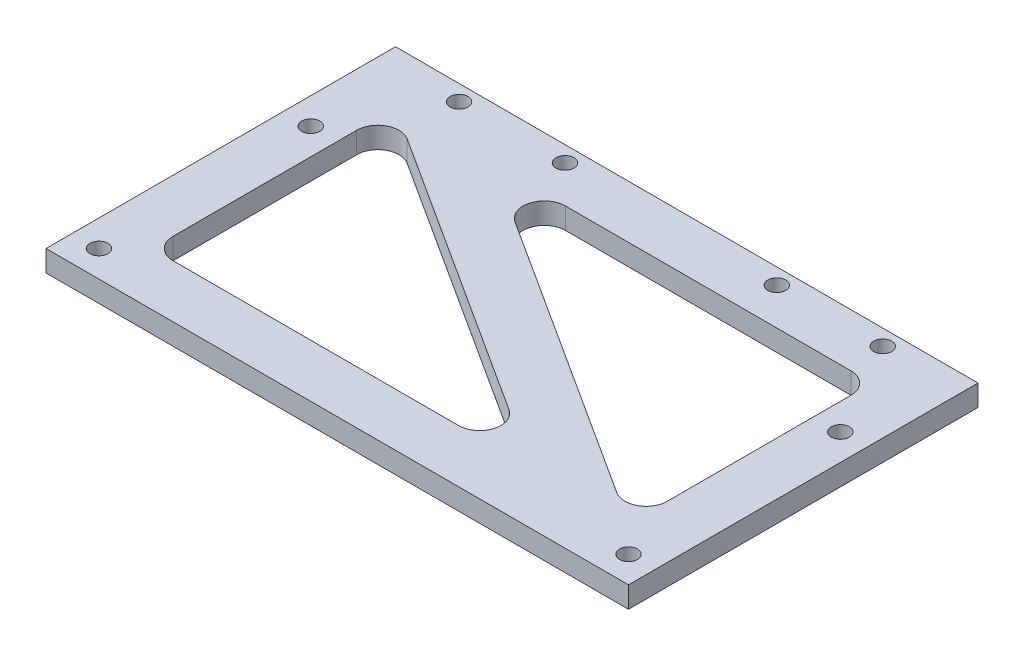
ISO-10303-21;
HEADER;
FILE_DESCRIPTION(('STEP AP214'),'2;1');
FILE_NAME('part.step','',(''),(''),'','','');
FILE_SCHEMA(('AUTOMOTIVE_DESIGN { 1 0 10303 214 1 1 1 1 }'));
ENDSEC;
DATA;
#1=APPLICATION_CONTEXT('core data for automotive mechanical design processes');
#2=APPLICATION_PROTOCOL_DEFINITION('international standard','automotive_design',2000,#1);
#3=PRODUCT_CONTEXT('',#1,'mechanical');
#4=PRODUCT('Part','Part','',(#3));
#5=PRODUCT_RELATED_PRODUCT_CATEGORY('part','',(#4));
#6=PRODUCT_DEFINITION_FORMATION('','',#4);
#7=PRODUCT_DEFINITION_CONTEXT('part definition',#1,'design');
#8=PRODUCT_DEFINITION('design','',#6,#7);
#9=PRODUCT_DEFINITION_SHAPE('','',#8);
#10=(LENGTH_UNIT() NAMED_UNIT(*) SI_UNIT(.MILLI.,.METRE.));
#11=(NAMED_UNIT(*) PLANE_ANGLE_UNIT() SI_UNIT($,.RADIAN.));
#12=(NAMED_UNIT(*) SI_UNIT($,.STERADIAN.) SOLID_ANGLE_UNIT());
#13=UNCERTAINTY_MEASURE_WITH_UNIT(LENGTH_MEASURE(1.E-05),#10,'distance_accuracy_value','');
#14=(GEOMETRIC_REPRESENTATION_CONTEXT(3) GLOBAL_UNCERTAINTY_ASSIGNED_CONTEXT((#13)) GLOBAL_UNIT_ASSIGNED_CONTEXT((#10,
#11,#12)) REPRESENTATION_CONTEXT('',''));
#15=CARTESIAN_POINT('',(0.,0.,0.));
#16=DIRECTION('',(0.,0.,1.));
#17=DIRECTION('',(1.,0.,0.));
#18=AXIS2_PLACEMENT_3D('',#15,#16,#17);
#19=CARTESIAN_POINT('',(0.,4.,0.));
#20=DIRECTION('',(0.,-1.,0.));
#21=DIRECTION('',(0.,0.,-1.));
#22=AXIS2_PLACEMENT_3D('',#19,#20,#21);
#23=PLANE('',#22);
#24=DIRECTION('',(0.841038517197505,0.,0.54097524212317));
#25=VECTOR('',#24,1.);
#26=CARTESIAN_POINT('',(28.4054789925488,4.,-44.1611742497059));
#27=LINE('',#26,#25);
#28=CARTESIAN_POINT('',(16.1639009684927,4.,-52.035237684518));
#29=VERTEX_POINT('',#28);
#30=CARTESIAN_POINT('',(70.0660289833704,4.,-17.36415406879));
#31=VERTEX_POINT('',#30);
#32=EDGE_CURVE('E310',#29,#31,#27,.T.);
#33=ORIENTED_EDGE('',*,*,#32,.T.);
#34=CARTESIAN_POINT('',(67.9021280148777,4.,-14.));
#35=DIRECTION('',(0.,-1.,0.));
#36=DIRECTION('',(0.,0.,-1.));
#37=AXIS2_PLACEMENT_3D('',#34,#35,#36);
#38=CIRCLE('',#37,4.);
#39=CARTESIAN_POINT('',(67.9021280148777,4.,-10.));
#40=VERTEX_POINT('',#39);
#41=EDGE_CURVE('E244',#31,#40,#38,.T.);
#42=ORIENTED_EDGE('',*,*,#41,.T.);
#43=DIRECTION('',(-1.,0.,0.));
#44=VECTOR('',#43,1.);
#45=CARTESIAN_POINT('',(0.,4.,-10.));
#46=LINE('',#45,#44);
#47=CARTESIAN_POINT('',(14.,4.,-10.));
#48=VERTEX_POINT('',#47);
#49=EDGE_CURVE('E311',#40,#48,#46,.T.);
#50=ORIENTED_EDGE('',*,*,#49,.T.);
#51=CARTESIAN_POINT('',(14.,4.,-14.));
#52=DIRECTION('',(0.,-1.,0.));
#53=DIRECTION('',(0.,0.,-1.));
#54=AXIS2_PLACEMENT_3D('',#51,#52,#53);
#55=CIRCLE('',#54,4.);
#56=CARTESIAN_POINT('',(10.,4.,-14.));
#57=VERTEX_POINT('',#56);
#58=EDGE_CURVE('E248',#48,#57,#55,.T.);
#59=ORIENTED_EDGE('',*,*,#58,.T.);
#60=DIRECTION('',(0.,0.,-1.));
#61=VECTOR('',#60,1.);
#62=CARTESIAN_POINT('',(10.,4.,0.));
#63=LINE('',#62,#61);
#64=CARTESIAN_POINT('',(10.,4.,-48.671083615728));
#65=VERTEX_POINT('',#64);
#66=EDGE_CURVE('E320',#57,#65,#63,.T.);
#67=ORIENTED_EDGE('',*,*,#66,.T.);
#68=CARTESIAN_POINT('',(14.,4.,-48.671083615728));
#69=DIRECTION('',(0.,-1.,0.));
#70=DIRECTION('',(0.,0.,-1.));
#71=AXIS2_PLACEMENT_3D('',#68,#69,#70);
#72=CIRCLE('',#71,4.);
#73=EDGE_CURVE('E254',#65,#29,#72,.T.);
#74=ORIENTED_EDGE('',*,*,#73,.T.);
#75=EDGE_LOOP('',(#33,#42,#50,#59,#67,#74));
#76=FACE_BOUND('',#75,.T.);
#77=DIRECTION('',(0.,0.,1.));
#78=VECTOR('',#77,1.);
#79=CARTESIAN_POINT('',(100.,4.,0.));
#80=LINE('',#79,#78);
#81=CARTESIAN_POINT('',(100.,4.,-52.));
#82=VERTEX_POINT('',#81);
#83=CARTESIAN_POINT('',(100.,4.,-17.3289163842721));
#84=VERTEX_POINT('',#83);
#85=EDGE_CURVE('E288',#82,#84,#80,.T.);
#86=ORIENTED_EDGE('',*,*,#85,.T.);
#87=CARTESIAN_POINT('',(96.,4.,-17.3289163842721));
#88=DIRECTION('',(0.,-1.,0.));
#89=DIRECTION('',(0.,0.,-1.));
#90=AXIS2_PLACEMENT_3D('',#87,#88,#89);
#91=CIRCLE('',#90,4.);
#92=CARTESIAN_POINT('',(93.8360990315073,4.,-13.964762315482));
#93=VERTEX_POINT('',#92);
#94=EDGE_CURVE('E261',#84,#93,#91,.T.);
#95=ORIENTED_EDGE('',*,*,#94,.T.);
#96=DIRECTION('',(-0.841038517197505,0.,-0.54097524212317));
#97=VECTOR('',#96,1.);
#98=CARTESIAN_POINT('',(33.8152314137805,4.,-52.571559421681));
#99=LINE('',#98,#97);
#100=CARTESIAN_POINT('',(39.9339710166296,4.,-48.63584593121));
#101=VERTEX_POINT('',#100);
#102=EDGE_CURVE('E296',#93,#101,#99,.T.);
#103=ORIENTED_EDGE('',*,*,#102,.T.);
#104=CARTESIAN_POINT('',(42.0978719851223,4.,-52.));
#105=DIRECTION('',(0.,-1.,0.));
#106=DIRECTION('',(0.,0.,-1.));
#107=AXIS2_PLACEMENT_3D('',#104,#105,#106);
#108=CIRCLE('',#107,4.);
#109=CARTESIAN_POINT('',(42.0978719851223,4.,-56.));
#110=VERTEX_POINT('',#109);
#111=EDGE_CURVE('E75',#101,#110,#108,.T.);
#112=ORIENTED_EDGE('',*,*,#111,.T.);
#113=DIRECTION('',(1.,0.,0.));
#114=VECTOR('',#113,1.);
#115=CARTESIAN_POINT('',(0.,4.,-56.));
#116=LINE('',#115,#114);
#117=CARTESIAN_POINT('',(96.,4.,-56.));
#118=VERTEX_POINT('',#117);
#119=EDGE_CURVE('E292',#110,#118,#116,.T.);
#120=ORIENTED_EDGE('',*,*,#119,.T.);
#121=CARTESIAN_POINT('',(96.,4.,-52.));
#122=DIRECTION('',(0.,-1.,0.));
#123=DIRECTION('',(0.,0.,-1.));
#124=AXIS2_PLACEMENT_3D('',#121,#122,#123);
#125=CIRCLE('',#124,4.);
#126=EDGE_CURVE('E11',#118,#82,#125,.T.);
#127=ORIENTED_EDGE('',*,*,#126,.T.);
#128=EDGE_LOOP('',(#86,#95,#103,#112,#120,#127));
#129=FACE_BOUND('',#128,.T.);
#130=DIRECTION('',(0.,0.,1.));
#131=VECTOR('',#130,1.);
#132=CARTESIAN_POINT('',(0.,4.,0.));
#133=LINE('',#132,#131);
#134=CARTESIAN_POINT('',(0.,4.,-66.));
#135=VERTEX_POINT('',#134);
#136=CARTESIAN_POINT('',(0.,4.,0.));
#137=VERTEX_POINT('',#136);
#138=EDGE_CURVE('E176',#135,#137,#133,.T.);
#139=ORIENTED_EDGE('',*,*,#138,.T.);
#140=DIRECTION('',(1.,0.,0.));
#141=VECTOR('',#140,1.);
#142=CARTESIAN_POINT('',(0.,4.,0.));
#143=LINE('',#142,#141);
#144=CARTESIAN_POINT('',(110.,4.,0.));
#145=VERTEX_POINT('',#144);
#146=EDGE_CURVE('E163',#137,#145,#143,.T.);
#147=ORIENTED_EDGE('',*,*,#146,.T.);
#148=DIRECTION('',(0.,0.,-1.));
#149=VECTOR('',#148,1.);
#150=CARTESIAN_POINT('',(110.,4.,0.));
#151=LINE('',#150,#149);
#152=CARTESIAN_POINT('',(110.,4.,-66.));
#153=VERTEX_POINT('',#152);
#154=EDGE_CURVE('E175',#145,#153,#151,.T.);
#155=ORIENTED_EDGE('',*,*,#154,.T.);
#156=DIRECTION('',(-1.,0.,0.));
#157=VECTOR('',#156,1.);
#158=CARTESIAN_POINT('',(0.,4.,-66.));
#159=LINE('',#158,#157);
#160=EDGE_CURVE('E182',#153,#135,#159,.T.);
#161=ORIENTED_EDGE('',*,*,#160,.T.);
#162=EDGE_LOOP('',(#139,#147,#155,#161));
#163=FACE_BOUND('',#162,.T.);
#164=CARTESIAN_POINT('',(4.99999999999999,4.,-45.));
#165=DIRECTION('',(0.,1.,0.));
#166=DIRECTION('',(0.,0.,1.));
#167=AXIS2_PLACEMENT_3D('',#164,#165,#166);
#168=CIRCLE('',#167,1.7);
#169=CARTESIAN_POINT('',(4.99999999999999,4.,-43.3));
#170=VERTEX_POINT('',#169);
#171=EDGE_CURVE('E380',#170,#170,#168,.T.);
#172=ORIENTED_EDGE('',*,*,#171,.F.);
#173=EDGE_LOOP('',(#172));
#174=FACE_BOUND('',#173,.T.);
#175=CARTESIAN_POINT('',(4.99999999999999,4.,-5.));
#176=DIRECTION('',(0.,1.,0.));
#177=DIRECTION('',(0.,0.,1.));
#178=AXIS2_PLACEMENT_3D('',#175,#176,#177);
#179=CIRCLE('',#178,1.7);
#180=CARTESIAN_POINT('',(4.99999999999999,4.,-3.3));
#181=VERTEX_POINT('',#180);
#182=EDGE_CURVE('E369',#181,#181,#179,.T.);
#183=ORIENTED_EDGE('',*,*,#182,.F.);
#184=EDGE_LOOP('',(#183));
#185=FACE_BOUND('',#184,.T.);
#186=CARTESIAN_POINT('',(105.,4.,-5.00000000000001));
#187=DIRECTION('',(0.,1.,0.));
#188=DIRECTION('',(0.,0.,-1.));
#189=AXIS2_PLACEMENT_3D('',#186,#187,#188);
#190=CIRCLE('',#189,1.7);
#191=CARTESIAN_POINT('',(105.,4.,-6.70000000000001));
#192=VERTEX_POINT('',#191);
#193=EDGE_CURVE('E363',#192,#192,#190,.T.);
#194=ORIENTED_EDGE('',*,*,#193,.F.);
#195=EDGE_LOOP('',(#194));
#196=FACE_BOUND('',#195,.T.);
#197=CARTESIAN_POINT('',(105.,4.,-45.));
#198=DIRECTION('',(0.,1.,0.));
#199=DIRECTION('',(0.,0.,-1.));
#200=AXIS2_PLACEMENT_3D('',#197,#198,#199);
#201=CIRCLE('',#200,1.7);
#202=CARTESIAN_POINT('',(105.,4.,-46.7));
#203=VERTEX_POINT('',#202);
#204=EDGE_CURVE('E354',#203,#203,#201,.T.);
#205=ORIENTED_EDGE('',*,*,#204,.F.);
#206=EDGE_LOOP('',(#205));
#207=FACE_BOUND('',#206,.T.);
#208=CARTESIAN_POINT('',(15.,4.,-63.));
#209=DIRECTION('',(0.,1.,0.));
#210=DIRECTION('',(0.,0.,1.));
#211=AXIS2_PLACEMENT_3D('',#208,#209,#210);
#212=CIRCLE('',#211,1.7);
#213=CARTESIAN_POINT('',(15.,4.,-61.3));
#214=VERTEX_POINT('',#213);
#215=EDGE_CURVE('E345',#214,#214,#212,.T.);
#216=ORIENTED_EDGE('',*,*,#215,.F.);
#217=EDGE_LOOP('',(#216));
#218=FACE_BOUND('',#217,.T.);
#219=CARTESIAN_POINT('',(35.,4.,-63.));
#220=DIRECTION('',(0.,1.,0.));
#221=DIRECTION('',(0.,0.,1.));
#222=AXIS2_PLACEMENT_3D('',#219,#220,#221);
#223=CIRCLE('',#222,1.7);
#224=CARTESIAN_POINT('',(35.,4.,-61.3));
#225=VERTEX_POINT('',#224);
#226=EDGE_CURVE('E339',#225,#225,#223,.T.);
#227=ORIENTED_EDGE('',*,*,#226,.F.);
#228=EDGE_LOOP('',(#227));
#229=FACE_BOUND('',#228,.T.);
#230=CARTESIAN_POINT('',(75.,4.,-63.));
#231=DIRECTION('',(0.,1.,0.));
#232=DIRECTION('',(0.,0.,-1.));
#233=AXIS2_PLACEMENT_3D('',#230,#231,#232);
#234=CIRCLE('',#233,1.7);
#235=CARTESIAN_POINT('',(75.,4.,-64.7));
#236=VERTEX_POINT('',#235);
#237=EDGE_CURVE('E329',#236,#236,#234,.T.);
#238=ORIENTED_EDGE('',*,*,#237,.F.);
#239=EDGE_LOOP('',(#238));
#240=FACE_BOUND('',#239,.T.);
#241=CARTESIAN_POINT('',(95.,4.,-63.));
#242=DIRECTION('',(0.,1.,0.));
#243=DIRECTION('',(0.,0.,-1.));
#244=AXIS2_PLACEMENT_3D('',#241,#242,#243);
#245=CIRCLE('',#244,1.7);
#246=CARTESIAN_POINT('',(95.,4.,-64.7));
#247=VERTEX_POINT('',#246);
#248=EDGE_CURVE('E325',#247,#247,#245,.T.);
#249=ORIENTED_EDGE('',*,*,#248,.F.);
#250=EDGE_LOOP('',(#249));
#251=FACE_BOUND('',#250,.T.);
#252=ADVANCED_FACE('F47',(#76,#129,#163,#174,#185,#196,#207,#218,#229,#240,#251),#23,.F.);
#253=CARTESIAN_POINT('',(0.,0.,0.));
#254=DIRECTION('',(0.,-1.,0.));
#255=DIRECTION('',(0.,0.,-1.));
#256=AXIS2_PLACEMENT_3D('',#253,#254,#255);
#257=PLANE('',#256);
#258=DIRECTION('',(0.,0.,-1.));
#259=VECTOR('',#258,1.);
#260=CARTESIAN_POINT('',(10.,0.,-10.));
#261=LINE('',#260,#259);
#262=CARTESIAN_POINT('',(10.,0.,-14.));
#263=VERTEX_POINT('',#262);
#264=CARTESIAN_POINT('',(10.,0.,-48.671083615728));
#265=VERTEX_POINT('',#264);
#266=EDGE_CURVE('E283',#263,#265,#261,.T.);
#267=ORIENTED_EDGE('',*,*,#266,.F.);
#268=CARTESIAN_POINT('',(14.,0.,-14.));
#269=DIRECTION('',(0.,-1.,0.));
#270=DIRECTION('',(0.,0.,-1.));
#271=AXIS2_PLACEMENT_3D('',#268,#269,#270);
#272=CIRCLE('',#271,4.);
#273=CARTESIAN_POINT('',(14.,0.,-10.));
#274=VERTEX_POINT('',#273);
#275=EDGE_CURVE('E246',#263,#274,#272,.F.);
#276=ORIENTED_EDGE('',*,*,#275,.T.);
#277=DIRECTION('',(-1.,0.,0.));
#278=VECTOR('',#277,1.);
#279=CARTESIAN_POINT('',(81.5148657066949,0.,-9.99999999999999));
#280=LINE('',#279,#278);
#281=CARTESIAN_POINT('',(67.9021280148777,0.,-10.));
#282=VERTEX_POINT('',#281);
#283=EDGE_CURVE('E495',#282,#274,#280,.T.);
#284=ORIENTED_EDGE('',*,*,#283,.F.);
#285=CARTESIAN_POINT('',(67.9021280148777,0.,-14.));
#286=DIRECTION('',(0.,-1.,0.));
#287=DIRECTION('',(0.,0.,-1.));
#288=AXIS2_PLACEMENT_3D('',#285,#286,#287);
#289=CIRCLE('',#288,4.);
#290=CARTESIAN_POINT('',(70.0660289833704,0.,-17.36415406879));
#291=VERTEX_POINT('',#290);
#292=EDGE_CURVE('E241',#282,#291,#289,.F.);
#293=ORIENTED_EDGE('',*,*,#292,.T.);
#294=DIRECTION('',(0.841038517197505,0.,0.54097524212317));
#295=VECTOR('',#294,1.);
#296=CARTESIAN_POINT('',(10.,0.,-56.));
#297=LINE('',#296,#295);
#298=CARTESIAN_POINT('',(16.1639009684927,0.,-52.035237684518));
#299=VERTEX_POINT('',#298);
#300=EDGE_CURVE('E497',#299,#291,#297,.T.);
#301=ORIENTED_EDGE('',*,*,#300,.F.);
#302=CARTESIAN_POINT('',(14.,0.,-48.671083615728));
#303=DIRECTION('',(0.,-1.,0.));
#304=DIRECTION('',(0.,0.,-1.));
#305=AXIS2_PLACEMENT_3D('',#302,#303,#304);
#306=CIRCLE('',#305,4.);
#307=EDGE_CURVE('E252',#299,#265,#306,.F.);
#308=ORIENTED_EDGE('',*,*,#307,.T.);
#309=EDGE_LOOP('',(#267,#276,#284,#293,#301,#308));
#310=FACE_BOUND('',#309,.T.);
#311=DIRECTION('',(1.,0.,0.));
#312=VECTOR('',#311,1.);
#313=CARTESIAN_POINT('',(28.4851342933051,0.,-56.));
#314=LINE('',#313,#312);
#315=CARTESIAN_POINT('',(42.0978719851223,0.,-56.));
#316=VERTEX_POINT('',#315);
#317=CARTESIAN_POINT('',(96.,0.,-56.));
#318=VERTEX_POINT('',#317);
#319=EDGE_CURVE('E277',#316,#318,#314,.T.);
#320=ORIENTED_EDGE('',*,*,#319,.F.);
#321=CARTESIAN_POINT('',(42.0978719851223,0.,-52.));
#322=DIRECTION('',(0.,-1.,0.));
#323=DIRECTION('',(0.,0.,-1.));
#324=AXIS2_PLACEMENT_3D('',#321,#322,#323);
#325=CIRCLE('',#324,4.);
#326=CARTESIAN_POINT('',(39.9339710166296,0.,-48.63584593121));
#327=VERTEX_POINT('',#326);
#328=EDGE_CURVE('E262',#316,#327,#325,.F.);
#329=ORIENTED_EDGE('',*,*,#328,.T.);
#330=DIRECTION('',(-0.841038517197505,0.,-0.54097524212317));
#331=VECTOR('',#330,1.);
#332=CARTESIAN_POINT('',(100.,0.,-10.));
#333=LINE('',#332,#331);
#334=CARTESIAN_POINT('',(93.8360990315073,0.,-13.964762315482));
#335=VERTEX_POINT('',#334);
#336=EDGE_CURVE('E297',#335,#327,#333,.T.);
#337=ORIENTED_EDGE('',*,*,#336,.F.);
#338=CARTESIAN_POINT('',(96.,0.,-17.3289163842721));
#339=DIRECTION('',(0.,-1.,0.));
#340=DIRECTION('',(0.,0.,-1.));
#341=AXIS2_PLACEMENT_3D('',#338,#339,#340);
#342=CIRCLE('',#341,4.);
#343=CARTESIAN_POINT('',(100.,0.,-17.3289163842721));
#344=VERTEX_POINT('',#343);
#345=EDGE_CURVE('E256',#335,#344,#342,.F.);
#346=ORIENTED_EDGE('',*,*,#345,.T.);
#347=DIRECTION('',(0.,0.,1.));
#348=VECTOR('',#347,1.);
#349=CARTESIAN_POINT('',(100.,0.,-56.));
#350=LINE('',#349,#348);
#351=CARTESIAN_POINT('',(100.,0.,-52.));
#352=VERTEX_POINT('',#351);
#353=EDGE_CURVE('E279',#352,#344,#350,.T.);
#354=ORIENTED_EDGE('',*,*,#353,.F.);
#355=CARTESIAN_POINT('',(96.,0.,-52.));
#356=DIRECTION('',(0.,-1.,0.));
#357=DIRECTION('',(0.,0.,-1.));
#358=AXIS2_PLACEMENT_3D('',#355,#356,#357);
#359=CIRCLE('',#358,4.);
#360=EDGE_CURVE('E59',#352,#318,#359,.F.);
#361=ORIENTED_EDGE('',*,*,#360,.T.);
#362=EDGE_LOOP('',(#320,#329,#337,#346,#354,#361));
#363=FACE_BOUND('',#362,.T.);
#364=CARTESIAN_POINT('',(75.,0.,-63.));
#365=DIRECTION('',(0.,1.,0.));
#366=DIRECTION('',(0.,0.,-1.));
#367=AXIS2_PLACEMENT_3D('',#364,#365,#366);
#368=CIRCLE('',#367,1.7);
#369=CARTESIAN_POINT('',(75.,0.,-64.7));
#370=VERTEX_POINT('',#369);
#371=EDGE_CURVE('E326',#370,#370,#368,.T.);
#372=ORIENTED_EDGE('',*,*,#371,.T.);
#373=EDGE_LOOP('',(#372));
#374=FACE_BOUND('',#373,.T.);
#375=CARTESIAN_POINT('',(15.,0.,-63.));
#376=DIRECTION('',(0.,1.,0.));
#377=DIRECTION('',(0.,0.,1.));
#378=AXIS2_PLACEMENT_3D('',#375,#376,#377);
#379=CIRCLE('',#378,1.7);
#380=CARTESIAN_POINT('',(15.,0.,-61.3));
#381=VERTEX_POINT('',#380);
#382=EDGE_CURVE('E341',#381,#381,#379,.T.);
#383=ORIENTED_EDGE('',*,*,#382,.T.);
#384=EDGE_LOOP('',(#383));
#385=FACE_BOUND('',#384,.T.);
#386=CARTESIAN_POINT('',(105.,0.,-5.00000000000001));
#387=DIRECTION('',(0.,1.,0.));
#388=DIRECTION('',(0.,0.,-1.));
#389=AXIS2_PLACEMENT_3D('',#386,#387,#388);
#390=CIRCLE('',#389,1.7);
#391=CARTESIAN_POINT('',(105.,0.,-6.70000000000001));
#392=VERTEX_POINT('',#391);
#393=EDGE_CURVE('E357',#392,#392,#390,.T.);
#394=ORIENTED_EDGE('',*,*,#393,.T.);
#395=EDGE_LOOP('',(#394));
#396=FACE_BOUND('',#395,.T.);
#397=CARTESIAN_POINT('',(4.99999999999999,0.,-45.));
#398=DIRECTION('',(0.,1.,0.));
#399=DIRECTION('',(0.,0.,1.));
#400=AXIS2_PLACEMENT_3D('',#397,#398,#399);
#401=CIRCLE('',#400,1.7);
#402=CARTESIAN_POINT('',(4.99999999999999,0.,-43.3));
#403=VERTEX_POINT('',#402);
#404=EDGE_CURVE('E373',#403,#403,#401,.T.);
#405=ORIENTED_EDGE('',*,*,#404,.T.);
#406=EDGE_LOOP('',(#405));
#407=FACE_BOUND('',#406,.T.);
#408=DIRECTION('',(0.,0.,1.));
#409=VECTOR('',#408,1.);
#410=CARTESIAN_POINT('',(0.,0.,0.));
#411=LINE('',#410,#409);
#412=CARTESIAN_POINT('',(0.,0.,-66.));
#413=VERTEX_POINT('',#412);
#414=CARTESIAN_POINT('',(0.,0.,0.));
#415=VERTEX_POINT('',#414);
#416=EDGE_CURVE('E190',#413,#415,#411,.T.);
#417=ORIENTED_EDGE('',*,*,#416,.F.);
#418=DIRECTION('',(-1.,0.,0.));
#419=VECTOR('',#418,1.);
#420=CARTESIAN_POINT('',(0.,0.,-66.));
#421=LINE('',#420,#419);
#422=CARTESIAN_POINT('',(110.,0.,-66.));
#423=VERTEX_POINT('',#422);
#424=EDGE_CURVE('E186',#423,#413,#421,.T.);
#425=ORIENTED_EDGE('',*,*,#424,.F.);
#426=DIRECTION('',(0.,0.,-1.));
#427=VECTOR('',#426,1.);
#428=CARTESIAN_POINT('',(110.,0.,0.));
#429=LINE('',#428,#427);
#430=CARTESIAN_POINT('',(110.,0.,0.));
#431=VERTEX_POINT('',#430);
#432=EDGE_CURVE('E393',#431,#423,#429,.T.);
#433=ORIENTED_EDGE('',*,*,#432,.F.);
#434=DIRECTION('',(1.,0.,0.));
#435=VECTOR('',#434,1.);
#436=CARTESIAN_POINT('',(0.,0.,0.));
#437=LINE('',#436,#435);
#438=EDGE_CURVE('E391',#415,#431,#437,.T.);
#439=ORIENTED_EDGE('',*,*,#438,.F.);
#440=EDGE_LOOP('',(#417,#425,#433,#439));
#441=FACE_BOUND('',#440,.T.);
#442=CARTESIAN_POINT('',(4.99999999999999,0.,-5.));
#443=DIRECTION('',(0.,1.,0.));
#444=DIRECTION('',(0.,0.,1.));
#445=AXIS2_PLACEMENT_3D('',#442,#443,#444);
#446=CIRCLE('',#445,1.7);
#447=CARTESIAN_POINT('',(4.99999999999999,0.,-3.3));
#448=VERTEX_POINT('',#447);
#449=EDGE_CURVE('E364',#448,#448,#446,.T.);
#450=ORIENTED_EDGE('',*,*,#449,.T.);
#451=EDGE_LOOP('',(#450));
#452=FACE_BOUND('',#451,.T.);
#453=CARTESIAN_POINT('',(105.,0.,-45.));
#454=DIRECTION('',(0.,1.,0.));
#455=DIRECTION('',(0.,0.,-1.));
#456=AXIS2_PLACEMENT_3D('',#453,#454,#455);
#457=CIRCLE('',#456,1.7);
#458=CARTESIAN_POINT('',(105.,0.,-46.7));
#459=VERTEX_POINT('',#458);
#460=EDGE_CURVE('E349',#459,#459,#457,.T.);
#461=ORIENTED_EDGE('',*,*,#460,.T.);
#462=EDGE_LOOP('',(#461));
#463=FACE_BOUND('',#462,.T.);
#464=CARTESIAN_POINT('',(35.,0.,-63.));
#465=DIRECTION('',(0.,1.,0.));
#466=DIRECTION('',(0.,0.,1.));
#467=AXIS2_PLACEMENT_3D('',#464,#465,#466);
#468=CIRCLE('',#467,1.7);
#469=CARTESIAN_POINT('',(35.,0.,-61.3));
#470=VERTEX_POINT('',#469);
#471=EDGE_CURVE('E331',#470,#470,#468,.T.);
#472=ORIENTED_EDGE('',*,*,#471,.T.);
#473=EDGE_LOOP('',(#472));
#474=FACE_BOUND('',#473,.T.);
#475=CARTESIAN_POINT('',(95.,0.,-63.));
#476=DIRECTION('',(0.,1.,0.));
#477=DIRECTION('',(0.,0.,-1.));
#478=AXIS2_PLACEMENT_3D('',#475,#476,#477);
#479=CIRCLE('',#478,1.7);
#480=CARTESIAN_POINT('',(95.,0.,-64.7));
#481=VERTEX_POINT('',#480);
#482=EDGE_CURVE('E321',#481,#481,#479,.T.);
#483=ORIENTED_EDGE('',*,*,#482,.T.);
#484=EDGE_LOOP('',(#483));
#485=FACE_BOUND('',#484,.T.);
#486=ADVANCED_FACE('F273',(#310,#363,#374,#385,#396,#407,#441,#452,#463,#474,#485),#257,.T.);
#487=CARTESIAN_POINT('',(0.,4.,0.));
#488=DIRECTION('',(1.,0.,0.));
#489=DIRECTION('',(0.,0.,-1.));
#490=AXIS2_PLACEMENT_3D('',#487,#488,#489);
#491=PLANE('',#490);
#492=ORIENTED_EDGE('',*,*,#416,.T.);
#493=DIRECTION('',(0.,-1.,0.));
#494=VECTOR('',#493,1.);
#495=CARTESIAN_POINT('',(0.,4.,0.));
#496=LINE('',#495,#494);
#497=EDGE_CURVE('E169',#137,#415,#496,.T.);
#498=ORIENTED_EDGE('',*,*,#497,.F.);
#499=ORIENTED_EDGE('',*,*,#138,.F.);
#500=DIRECTION('',(0.,-1.,0.));
#501=VECTOR('',#500,1.);
#502=CARTESIAN_POINT('',(0.,4.,-66.));
#503=LINE('',#502,#501);
#504=EDGE_CURVE('E389',#135,#413,#503,.T.);
#505=ORIENTED_EDGE('',*,*,#504,.T.);
#506=EDGE_LOOP('',(#492,#498,#499,#505));
#507=FACE_BOUND('',#506,.T.);
#508=ADVANCED_FACE('F189',(#507),#491,.F.);
#509=CARTESIAN_POINT('',(0.,4.,0.));
#510=DIRECTION('',(0.,0.,-1.));
#511=DIRECTION('',(-1.,0.,0.));
#512=AXIS2_PLACEMENT_3D('',#509,#510,#511);
#513=PLANE('',#512);
#514=ORIENTED_EDGE('',*,*,#438,.T.);
#515=DIRECTION('',(0.,-1.,0.));
#516=VECTOR('',#515,1.);
#517=CARTESIAN_POINT('',(110.,4.,0.));
#518=LINE('',#517,#516);
#519=EDGE_CURVE('E171',#145,#431,#518,.T.);
#520=ORIENTED_EDGE('',*,*,#519,.F.);
#521=ORIENTED_EDGE('',*,*,#146,.F.);
#522=ORIENTED_EDGE('',*,*,#497,.T.);
#523=EDGE_LOOP('',(#514,#520,#521,#522));
#524=FACE_BOUND('',#523,.T.);
#525=ADVANCED_FACE('F167',(#524),#513,.F.);
#526=CARTESIAN_POINT('',(110.,4.,0.));
#527=DIRECTION('',(-1.,0.,0.));
#528=DIRECTION('',(0.,0.,1.));
#529=AXIS2_PLACEMENT_3D('',#526,#527,#528);
#530=PLANE('',#529);
#531=ORIENTED_EDGE('',*,*,#432,.T.);
#532=DIRECTION('',(0.,-1.,0.));
#533=VECTOR('',#532,1.);
#534=CARTESIAN_POINT('',(110.,4.,-66.));
#535=LINE('',#534,#533);
#536=EDGE_CURVE('E199',#153,#423,#535,.T.);
#537=ORIENTED_EDGE('',*,*,#536,.F.);
#538=ORIENTED_EDGE('',*,*,#154,.F.);
#539=ORIENTED_EDGE('',*,*,#519,.T.);
#540=EDGE_LOOP('',(#531,#537,#538,#539));
#541=FACE_BOUND('',#540,.T.);
#542=ADVANCED_FACE('F411',(#541),#530,.F.);
#543=CARTESIAN_POINT('',(0.,4.,-66.));
#544=DIRECTION('',(0.,0.,1.));
#545=DIRECTION('',(1.,0.,0.));
#546=AXIS2_PLACEMENT_3D('',#543,#544,#545);
#547=PLANE('',#546);
#548=ORIENTED_EDGE('',*,*,#424,.T.);
#549=ORIENTED_EDGE('',*,*,#504,.F.);
#550=ORIENTED_EDGE('',*,*,#160,.F.);
#551=ORIENTED_EDGE('',*,*,#536,.T.);
#552=EDGE_LOOP('',(#548,#549,#550,#551));
#553=FACE_BOUND('',#552,.T.);
#554=ADVANCED_FACE('F406',(#553),#547,.F.);
#555=CARTESIAN_POINT('',(4.99999999999999,4.,-45.));
#556=DIRECTION('',(0.,-1.,0.));
#557=DIRECTION('',(0.,0.,-1.));
#558=AXIS2_PLACEMENT_3D('',#555,#556,#557);
#559=CYLINDRICAL_SURFACE('',#558,1.7);
#560=ORIENTED_EDGE('',*,*,#171,.T.);
#561=EDGE_LOOP('',(#560));
#562=FACE_BOUND('',#561,.T.);
#563=ORIENTED_EDGE('',*,*,#404,.F.);
#564=EDGE_LOOP('',(#563));
#565=FACE_BOUND('',#564,.T.);
#566=ADVANCED_FACE('F417',(#562,#565),#559,.F.);
#567=CARTESIAN_POINT('',(4.99999999999999,4.,-5.));
#568=DIRECTION('',(0.,-1.,0.));
#569=DIRECTION('',(0.,0.,-1.));
#570=AXIS2_PLACEMENT_3D('',#567,#568,#569);
#571=CYLINDRICAL_SURFACE('',#570,1.7);
#572=ORIENTED_EDGE('',*,*,#182,.T.);
#573=EDGE_LOOP('',(#572));
#574=FACE_BOUND('',#573,.T.);
#575=ORIENTED_EDGE('',*,*,#449,.F.);
#576=EDGE_LOOP('',(#575));
#577=FACE_BOUND('',#576,.T.);
#578=ADVANCED_FACE('F429',(#574,#577),#571,.F.);
#579=CARTESIAN_POINT('',(105.,4.,-5.00000000000001));
#580=DIRECTION('',(0.,-1.,0.));
#581=DIRECTION('',(0.,0.,-1.));
#582=AXIS2_PLACEMENT_3D('',#579,#580,#581);
#583=CYLINDRICAL_SURFACE('',#582,1.7);
#584=ORIENTED_EDGE('',*,*,#193,.T.);
#585=EDGE_LOOP('',(#584));
#586=FACE_BOUND('',#585,.T.);
#587=ORIENTED_EDGE('',*,*,#393,.F.);
#588=EDGE_LOOP('',(#587));
#589=FACE_BOUND('',#588,.T.);
#590=ADVANCED_FACE('F432',(#586,#589),#583,.F.);
#591=CARTESIAN_POINT('',(105.,4.,-45.));
#592=DIRECTION('',(0.,-1.,0.));
#593=DIRECTION('',(0.,0.,-1.));
#594=AXIS2_PLACEMENT_3D('',#591,#592,#593);
#595=CYLINDRICAL_SURFACE('',#594,1.7);
#596=ORIENTED_EDGE('',*,*,#204,.T.);
#597=EDGE_LOOP('',(#596));
#598=FACE_BOUND('',#597,.T.);
#599=ORIENTED_EDGE('',*,*,#460,.F.);
#600=EDGE_LOOP('',(#599));
#601=FACE_BOUND('',#600,.T.);
#602=ADVANCED_FACE('F437',(#598,#601),#595,.F.);
#603=CARTESIAN_POINT('',(15.,4.,-63.));
#604=DIRECTION('',(0.,-1.,0.));
#605=DIRECTION('',(0.,0.,-1.));
#606=AXIS2_PLACEMENT_3D('',#603,#604,#605);
#607=CYLINDRICAL_SURFACE('',#606,1.7);
#608=ORIENTED_EDGE('',*,*,#215,.T.);
#609=EDGE_LOOP('',(#608));
#610=FACE_BOUND('',#609,.T.);
#611=ORIENTED_EDGE('',*,*,#382,.F.);
#612=EDGE_LOOP('',(#611));
#613=FACE_BOUND('',#612,.T.);
#614=ADVANCED_FACE('F445',(#610,#613),#607,.F.);
#615=CARTESIAN_POINT('',(35.,4.,-63.));
#616=DIRECTION('',(0.,-1.,0.));
#617=DIRECTION('',(0.,0.,-1.));
#618=AXIS2_PLACEMENT_3D('',#615,#616,#617);
#619=CYLINDRICAL_SURFACE('',#618,1.7);
#620=ORIENTED_EDGE('',*,*,#226,.T.);
#621=EDGE_LOOP('',(#620));
#622=FACE_BOUND('',#621,.T.);
#623=ORIENTED_EDGE('',*,*,#471,.F.);
#624=EDGE_LOOP('',(#623));
#625=FACE_BOUND('',#624,.T.);
#626=ADVANCED_FACE('F446',(#622,#625),#619,.F.);
#627=CARTESIAN_POINT('',(75.,4.,-63.));
#628=DIRECTION('',(0.,-1.,0.));
#629=DIRECTION('',(0.,0.,-1.));
#630=AXIS2_PLACEMENT_3D('',#627,#628,#629);
#631=CYLINDRICAL_SURFACE('',#630,1.7);
#632=ORIENTED_EDGE('',*,*,#237,.T.);
#633=EDGE_LOOP('',(#632));
#634=FACE_BOUND('',#633,.T.);
#635=ORIENTED_EDGE('',*,*,#371,.F.);
#636=EDGE_LOOP('',(#635));
#637=FACE_BOUND('',#636,.T.);
#638=ADVANCED_FACE('F450',(#634,#637),#631,.F.);
#639=CARTESIAN_POINT('',(95.,4.,-63.));
#640=DIRECTION('',(0.,-1.,0.));
#641=DIRECTION('',(0.,0.,-1.));
#642=AXIS2_PLACEMENT_3D('',#639,#640,#641);
#643=CYLINDRICAL_SURFACE('',#642,1.7);
#644=ORIENTED_EDGE('',*,*,#248,.T.);
#645=EDGE_LOOP('',(#644));
#646=FACE_BOUND('',#645,.T.);
#647=ORIENTED_EDGE('',*,*,#482,.F.);
#648=EDGE_LOOP('',(#647));
#649=FACE_BOUND('',#648,.T.);
#650=ADVANCED_FACE('F453',(#646,#649),#643,.F.);
#651=CARTESIAN_POINT('',(28.4851342933051,10.,-56.));
#652=DIRECTION('',(0.,0.,-1.));
#653=DIRECTION('',(-1.,0.,0.));
#654=AXIS2_PLACEMENT_3D('',#651,#652,#653);
#655=PLANE('',#654);
#656=ORIENTED_EDGE('',*,*,#119,.F.);
#657=DIRECTION('',(0.,-1.,0.));
#658=VECTOR('',#657,1.);
#659=CARTESIAN_POINT('',(42.0978719851223,0.,-56.));
#660=LINE('',#659,#658);
#661=EDGE_CURVE('E240',#110,#316,#660,.T.);
#662=ORIENTED_EDGE('',*,*,#661,.T.);
#663=ORIENTED_EDGE('',*,*,#319,.T.);
#664=DIRECTION('',(0.,-1.,0.));
#665=VECTOR('',#664,1.);
#666=CARTESIAN_POINT('',(96.,4.,-56.));
#667=LINE('',#666,#665);
#668=EDGE_CURVE('E65',#318,#118,#667,.F.);
#669=ORIENTED_EDGE('',*,*,#668,.T.);
#670=EDGE_LOOP('',(#656,#662,#663,#669));
#671=FACE_BOUND('',#670,.T.);
#672=ADVANCED_FACE('F281',(#671),#655,.F.);
#673=CARTESIAN_POINT('',(100.,10.,-10.));
#674=DIRECTION('',(-0.540975242123169,0.,0.841038517197505));
#675=DIRECTION('',(0.841038517197505,0.,0.54097524212317));
#676=AXIS2_PLACEMENT_3D('',#673,#674,#675);
#677=PLANE('',#676);
#678=ORIENTED_EDGE('',*,*,#102,.F.);
#679=DIRECTION('',(0.,-1.,0.));
#680=VECTOR('',#679,1.);
#681=CARTESIAN_POINT('',(93.8360990315073,0.,-13.964762315482));
#682=LINE('',#681,#680);
#683=EDGE_CURVE('E221',#93,#335,#682,.T.);
#684=ORIENTED_EDGE('',*,*,#683,.T.);
#685=ORIENTED_EDGE('',*,*,#336,.T.);
#686=DIRECTION('',(0.,-1.,0.));
#687=VECTOR('',#686,1.);
#688=CARTESIAN_POINT('',(39.9339710166296,4.,-48.63584593121));
#689=LINE('',#688,#687);
#690=EDGE_CURVE('E222',#327,#101,#689,.F.);
#691=ORIENTED_EDGE('',*,*,#690,.T.);
#692=EDGE_LOOP('',(#678,#684,#685,#691));
#693=FACE_BOUND('',#692,.T.);
#694=ADVANCED_FACE('F461',(#693),#677,.F.);
#695=CARTESIAN_POINT('',(100.,10.,-56.));
#696=DIRECTION('',(1.,0.,0.));
#697=DIRECTION('',(0.,0.,-1.));
#698=AXIS2_PLACEMENT_3D('',#695,#696,#697);
#699=PLANE('',#698);
#700=ORIENTED_EDGE('',*,*,#353,.T.);
#701=DIRECTION('',(0.,-1.,0.));
#702=VECTOR('',#701,1.);
#703=CARTESIAN_POINT('',(100.,4.,-17.3289163842721));
#704=LINE('',#703,#702);
#705=EDGE_CURVE('E232',#344,#84,#704,.F.);
#706=ORIENTED_EDGE('',*,*,#705,.T.);
#707=ORIENTED_EDGE('',*,*,#85,.F.);
#708=DIRECTION('',(0.,-1.,0.));
#709=VECTOR('',#708,1.);
#710=CARTESIAN_POINT('',(100.,0.,-52.));
#711=LINE('',#710,#709);
#712=EDGE_CURVE('E229',#82,#352,#711,.T.);
#713=ORIENTED_EDGE('',*,*,#712,.T.);
#714=EDGE_LOOP('',(#700,#706,#707,#713));
#715=FACE_BOUND('',#714,.T.);
#716=ADVANCED_FACE('F291',(#715),#699,.F.);
#717=CARTESIAN_POINT('',(10.,10.,-10.));
#718=DIRECTION('',(-1.,0.,0.));
#719=DIRECTION('',(0.,0.,1.));
#720=AXIS2_PLACEMENT_3D('',#717,#718,#719);
#721=PLANE('',#720);
#722=ORIENTED_EDGE('',*,*,#66,.F.);
#723=DIRECTION('',(0.,-1.,0.));
#724=VECTOR('',#723,1.);
#725=CARTESIAN_POINT('',(10.,0.,-14.));
#726=LINE('',#725,#724);
#727=EDGE_CURVE('E220',#57,#263,#726,.T.);
#728=ORIENTED_EDGE('',*,*,#727,.T.);
#729=ORIENTED_EDGE('',*,*,#266,.T.);
#730=DIRECTION('',(0.,-1.,0.));
#731=VECTOR('',#730,1.);
#732=CARTESIAN_POINT('',(10.,4.,-48.671083615728));
#733=LINE('',#732,#731);
#734=EDGE_CURVE('E212',#265,#65,#733,.F.);
#735=ORIENTED_EDGE('',*,*,#734,.T.);
#736=EDGE_LOOP('',(#722,#728,#729,#735));
#737=FACE_BOUND('',#736,.T.);
#738=ADVANCED_FACE('F463',(#737),#721,.F.);
#739=CARTESIAN_POINT('',(81.5148657066949,10.,-9.99999999999999));
#740=DIRECTION('',(0.,0.,1.));
#741=DIRECTION('',(1.,0.,0.));
#742=AXIS2_PLACEMENT_3D('',#739,#740,#741);
#743=PLANE('',#742);
#744=ORIENTED_EDGE('',*,*,#49,.F.);
#745=DIRECTION('',(0.,-1.,0.));
#746=VECTOR('',#745,1.);
#747=CARTESIAN_POINT('',(67.9021280148777,0.,-10.));
#748=LINE('',#747,#746);
#749=EDGE_CURVE('E197',#40,#282,#748,.T.);
#750=ORIENTED_EDGE('',*,*,#749,.T.);
#751=ORIENTED_EDGE('',*,*,#283,.T.);
#752=DIRECTION('',(0.,-1.,0.));
#753=VECTOR('',#752,1.);
#754=CARTESIAN_POINT('',(14.,4.,-10.));
#755=LINE('',#754,#753);
#756=EDGE_CURVE('E192',#274,#48,#755,.F.);
#757=ORIENTED_EDGE('',*,*,#756,.T.);
#758=EDGE_LOOP('',(#744,#750,#751,#757));
#759=FACE_BOUND('',#758,.T.);
#760=ADVANCED_FACE('F469',(#759),#743,.F.);
#761=CARTESIAN_POINT('',(10.,10.,-56.));
#762=DIRECTION('',(0.54097524212317,0.,-0.841038517197505));
#763=DIRECTION('',(-0.841038517197505,0.,-0.54097524212317));
#764=AXIS2_PLACEMENT_3D('',#761,#762,#763);
#765=PLANE('',#764);
#766=ORIENTED_EDGE('',*,*,#300,.T.);
#767=DIRECTION('',(0.,-1.,0.));
#768=VECTOR('',#767,1.);
#769=CARTESIAN_POINT('',(70.0660289833704,4.,-17.36415406879));
#770=LINE('',#769,#768);
#771=EDGE_CURVE('E211',#291,#31,#770,.F.);
#772=ORIENTED_EDGE('',*,*,#771,.T.);
#773=ORIENTED_EDGE('',*,*,#32,.F.);
#774=DIRECTION('',(0.,-1.,0.));
#775=VECTOR('',#774,1.);
#776=CARTESIAN_POINT('',(16.1639009684927,0.,-52.035237684518));
#777=LINE('',#776,#775);
#778=EDGE_CURVE('E210',#29,#299,#777,.T.);
#779=ORIENTED_EDGE('',*,*,#778,.T.);
#780=EDGE_LOOP('',(#766,#772,#773,#779));
#781=FACE_BOUND('',#780,.T.);
#782=ADVANCED_FACE('F473',(#781),#765,.F.);
#783=CARTESIAN_POINT('',(67.9021280148777,10.,-14.));
#784=DIRECTION('',(0.,1.,0.));
#785=DIRECTION('',(0.,0.,1.));
#786=AXIS2_PLACEMENT_3D('',#783,#784,#785);
#787=CYLINDRICAL_SURFACE('',#786,4.);
#788=ORIENTED_EDGE('',*,*,#41,.F.);
#789=ORIENTED_EDGE('',*,*,#771,.F.);
#790=ORIENTED_EDGE('',*,*,#292,.F.);
#791=ORIENTED_EDGE('',*,*,#749,.F.);
#792=EDGE_LOOP('',(#788,#789,#790,#791));
#793=FACE_BOUND('',#792,.T.);
#794=ADVANCED_FACE('F474',(#793),#787,.F.);
#795=CARTESIAN_POINT('',(14.,10.,-14.));
#796=DIRECTION('',(0.,1.,0.));
#797=DIRECTION('',(0.,0.,1.));
#798=AXIS2_PLACEMENT_3D('',#795,#796,#797);
#799=CYLINDRICAL_SURFACE('',#798,4.);
#800=ORIENTED_EDGE('',*,*,#58,.F.);
#801=ORIENTED_EDGE('',*,*,#756,.F.);
#802=ORIENTED_EDGE('',*,*,#275,.F.);
#803=ORIENTED_EDGE('',*,*,#727,.F.);
#804=EDGE_LOOP('',(#800,#801,#802,#803));
#805=FACE_BOUND('',#804,.T.);
#806=ADVANCED_FACE('F488',(#805),#799,.F.);
#807=CARTESIAN_POINT('',(14.,10.,-48.671083615728));
#808=DIRECTION('',(0.,1.,0.));
#809=DIRECTION('',(0.,0.,1.));
#810=AXIS2_PLACEMENT_3D('',#807,#808,#809);
#811=CYLINDRICAL_SURFACE('',#810,4.);
#812=ORIENTED_EDGE('',*,*,#73,.F.);
#813=ORIENTED_EDGE('',*,*,#734,.F.);
#814=ORIENTED_EDGE('',*,*,#307,.F.);
#815=ORIENTED_EDGE('',*,*,#778,.F.);
#816=EDGE_LOOP('',(#812,#813,#814,#815));
#817=FACE_BOUND('',#816,.T.);
#818=ADVANCED_FACE('F519',(#817),#811,.F.);
#819=CARTESIAN_POINT('',(96.,10.,-17.3289163842721));
#820=DIRECTION('',(0.,1.,0.));
#821=DIRECTION('',(0.,0.,1.));
#822=AXIS2_PLACEMENT_3D('',#819,#820,#821);
#823=CYLINDRICAL_SURFACE('',#822,4.);
#824=ORIENTED_EDGE('',*,*,#94,.F.);
#825=ORIENTED_EDGE('',*,*,#705,.F.);
#826=ORIENTED_EDGE('',*,*,#345,.F.);
#827=ORIENTED_EDGE('',*,*,#683,.F.);
#828=EDGE_LOOP('',(#824,#825,#826,#827));
#829=FACE_BOUND('',#828,.T.);
#830=ADVANCED_FACE('F507',(#829),#823,.F.);
#831=CARTESIAN_POINT('',(42.0978719851223,10.,-52.));
#832=DIRECTION('',(0.,1.,0.));
#833=DIRECTION('',(0.,0.,1.));
#834=AXIS2_PLACEMENT_3D('',#831,#832,#833);
#835=CYLINDRICAL_SURFACE('',#834,4.);
#836=ORIENTED_EDGE('',*,*,#111,.F.);
#837=ORIENTED_EDGE('',*,*,#690,.F.);
#838=ORIENTED_EDGE('',*,*,#328,.F.);
#839=ORIENTED_EDGE('',*,*,#661,.F.);
#840=EDGE_LOOP('',(#836,#837,#838,#839));
#841=FACE_BOUND('',#840,.T.);
#842=ADVANCED_FACE('F511',(#841),#835,.F.);
#843=CARTESIAN_POINT('',(96.,10.,-52.));
#844=DIRECTION('',(0.,1.,0.));
#845=DIRECTION('',(0.,0.,1.));
#846=AXIS2_PLACEMENT_3D('',#843,#844,#845);
#847=CYLINDRICAL_SURFACE('',#846,4.);
#848=ORIENTED_EDGE('',*,*,#126,.F.);
#849=ORIENTED_EDGE('',*,*,#668,.F.);
#850=ORIENTED_EDGE('',*,*,#360,.F.);
#851=ORIENTED_EDGE('',*,*,#712,.F.);
#852=EDGE_LOOP('',(#848,#849,#850,#851));
#853=FACE_BOUND('',#852,.T.);
#854=ADVANCED_FACE('F51',(#853),#847,.F.);
#855=CLOSED_SHELL('',(#252,#486,#508,#525,#542,#554,#566,#578,#590,#602,#614,#626,#638,#650,
#672,#694,#716,#738,#760,#782,#794,#806,#818,#830,#842,#854));
#856=MANIFOLD_SOLID_BREP('B2',#855);
#857=ADVANCED_BREP_SHAPE_REPRESENTATION('',(#18,#856),#14);
#858=SHAPE_DEFINITION_REPRESENTATION(#9,#857);
ENDSEC;
END-ISO-10303-21;
